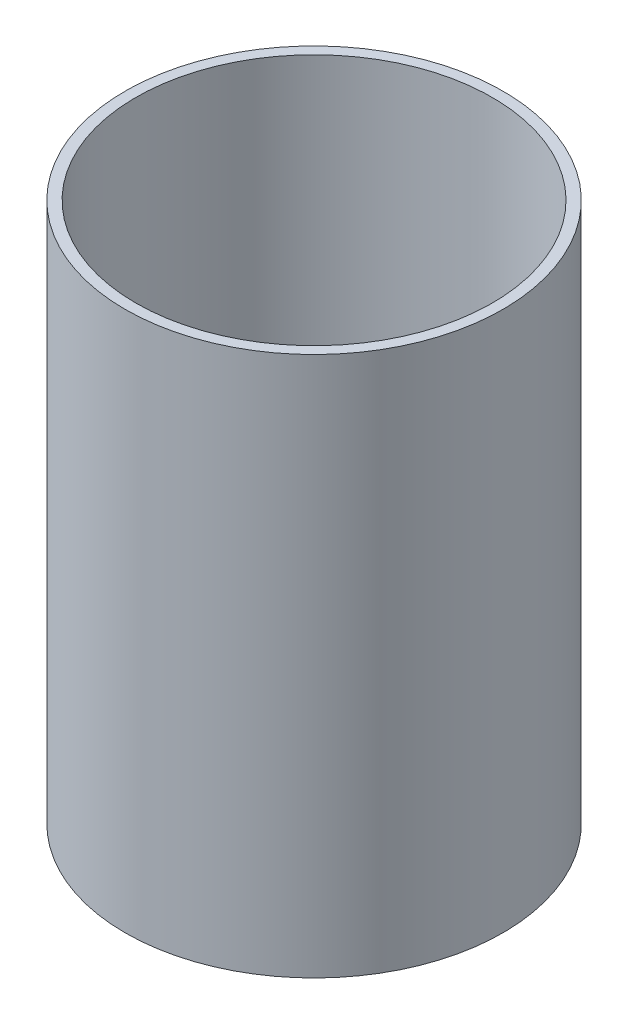
ISO-10303-21;
HEADER;
FILE_DESCRIPTION(('STEP AP214'),'2;1');
FILE_NAME('part.step','',(''),(''),'','','');
FILE_SCHEMA(('AUTOMOTIVE_DESIGN { 1 0 10303 214 1 1 1 1 }'));
ENDSEC;
DATA;
#1=APPLICATION_CONTEXT('core data for automotive mechanical design processes');
#2=APPLICATION_PROTOCOL_DEFINITION('international standard','automotive_design',2000,#1);
#3=PRODUCT_CONTEXT('',#1,'mechanical');
#4=PRODUCT('Part','Part','',(#3));
#5=PRODUCT_RELATED_PRODUCT_CATEGORY('part','',(#4));
#6=PRODUCT_DEFINITION_FORMATION('','',#4);
#7=PRODUCT_DEFINITION_CONTEXT('part definition',#1,'design');
#8=PRODUCT_DEFINITION('design','',#6,#7);
#9=PRODUCT_DEFINITION_SHAPE('','',#8);
#10=(LENGTH_UNIT() NAMED_UNIT(*) SI_UNIT(.MILLI.,.METRE.));
#11=(NAMED_UNIT(*) PLANE_ANGLE_UNIT() SI_UNIT($,.RADIAN.));
#12=(NAMED_UNIT(*) SI_UNIT($,.STERADIAN.) SOLID_ANGLE_UNIT());
#13=UNCERTAINTY_MEASURE_WITH_UNIT(LENGTH_MEASURE(1.E-05),#10,'distance_accuracy_value','');
#14=(GEOMETRIC_REPRESENTATION_CONTEXT(3) GLOBAL_UNCERTAINTY_ASSIGNED_CONTEXT((#13)) GLOBAL_UNIT_ASSIGNED_CONTEXT((#10,
#11,#12)) REPRESENTATION_CONTEXT('',''));
#15=CARTESIAN_POINT('',(0.,0.,0.));
#16=DIRECTION('',(0.,0.,1.));
#17=DIRECTION('',(1.,0.,0.));
#18=AXIS2_PLACEMENT_3D('',#15,#16,#17);
#19=CARTESIAN_POINT('',(0.,50.,0.));
#20=DIRECTION('',(0.,1.,0.));
#21=DIRECTION('',(0.,0.,1.));
#22=AXIS2_PLACEMENT_3D('',#19,#20,#21);
#23=PLANE('',#22);
#24=CARTESIAN_POINT('',(0.,50.,0.));
#25=DIRECTION('',(0.,1.,0.));
#26=DIRECTION('',(0.,0.,1.));
#27=AXIS2_PLACEMENT_3D('',#24,#25,#26);
#28=CIRCLE('',#27,17.5);
#29=CARTESIAN_POINT('',(0.,50.,17.5));
#30=VERTEX_POINT('',#29);
#31=EDGE_CURVE('E50',#30,#30,#28,.T.);
#32=ORIENTED_EDGE('',*,*,#31,.T.);
#33=EDGE_LOOP('',(#32));
#34=FACE_BOUND('',#33,.T.);
#35=CARTESIAN_POINT('',(0.,50.,0.));
#36=DIRECTION('',(0.,1.,0.));
#37=DIRECTION('',(0.,0.,1.));
#38=AXIS2_PLACEMENT_3D('',#35,#36,#37);
#39=CIRCLE('',#38,16.5);
#40=CARTESIAN_POINT('',(0.,50.,16.5));
#41=VERTEX_POINT('',#40);
#42=EDGE_CURVE('E61',#41,#41,#39,.T.);
#43=ORIENTED_EDGE('',*,*,#42,.F.);
#44=EDGE_LOOP('',(#43));
#45=FACE_BOUND('',#44,.T.);
#46=ADVANCED_FACE('F42',(#34,#45),#23,.T.);
#47=CARTESIAN_POINT('',(0.,0.,0.));
#48=DIRECTION('',(0.,1.,0.));
#49=DIRECTION('',(0.,0.,1.));
#50=AXIS2_PLACEMENT_3D('',#47,#48,#49);
#51=PLANE('',#50);
#52=CARTESIAN_POINT('',(0.,0.,0.));
#53=DIRECTION('',(0.,1.,0.));
#54=DIRECTION('',(0.,0.,1.));
#55=AXIS2_PLACEMENT_3D('',#52,#53,#54);
#56=CIRCLE('',#55,17.5);
#57=CARTESIAN_POINT('',(0.,0.,17.5));
#58=VERTEX_POINT('',#57);
#59=EDGE_CURVE('E55',#58,#58,#56,.T.);
#60=ORIENTED_EDGE('',*,*,#59,.F.);
#61=EDGE_LOOP('',(#60));
#62=FACE_BOUND('',#61,.T.);
#63=ADVANCED_FACE('F70',(#62),#51,.F.);
#64=CARTESIAN_POINT('',(0.,50.,0.));
#65=DIRECTION('',(0.,-1.,0.));
#66=DIRECTION('',(0.,0.,-1.));
#67=AXIS2_PLACEMENT_3D('',#64,#65,#66);
#68=CYLINDRICAL_SURFACE('',#67,17.5);
#69=ORIENTED_EDGE('',*,*,#31,.F.);
#70=EDGE_LOOP('',(#69));
#71=FACE_BOUND('',#70,.T.);
#72=ORIENTED_EDGE('',*,*,#59,.T.);
#73=EDGE_LOOP('',(#72));
#74=FACE_BOUND('',#73,.T.);
#75=ADVANCED_FACE('F44',(#71,#74),#68,.T.);
#76=CARTESIAN_POINT('',(0.,50.,0.));
#77=DIRECTION('',(0.,-1.,0.));
#78=DIRECTION('',(0.,0.,-1.));
#79=AXIS2_PLACEMENT_3D('',#76,#77,#78);
#80=CYLINDRICAL_SURFACE('',#79,16.5);
#81=CARTESIAN_POINT('',(0.,2.,0.));
#82=DIRECTION('',(0.,1.,0.));
#83=DIRECTION('',(0.,0.,1.));
#84=AXIS2_PLACEMENT_3D('',#81,#82,#83);
#85=CIRCLE('',#84,16.5);
#86=CARTESIAN_POINT('',(0.,2.,16.5));
#87=VERTEX_POINT('',#86);
#88=EDGE_CURVE('E10',#87,#87,#85,.T.);
#89=ORIENTED_EDGE('',*,*,#88,.F.);
#90=EDGE_LOOP('',(#89));
#91=FACE_BOUND('',#90,.T.);
#92=ORIENTED_EDGE('',*,*,#42,.T.);
#93=EDGE_LOOP('',(#92));
#94=FACE_BOUND('',#93,.T.);
#95=ADVANCED_FACE('F67',(#91,#94),#80,.F.);
#96=CARTESIAN_POINT('',(0.,2.,0.));
#97=DIRECTION('',(0.,1.,0.));
#98=DIRECTION('',(0.,0.,1.));
#99=AXIS2_PLACEMENT_3D('',#96,#97,#98);
#100=PLANE('',#99);
#101=ORIENTED_EDGE('',*,*,#88,.T.);
#102=EDGE_LOOP('',(#101));
#103=FACE_BOUND('',#102,.T.);
#104=ADVANCED_FACE('F79',(#103),#100,.T.);
#105=CLOSED_SHELL('',(#46,#63,#75,#95,#104));
#106=MANIFOLD_SOLID_BREP('B2',#105);
#107=ADVANCED_BREP_SHAPE_REPRESENTATION('',(#18,#106),#14);
#108=SHAPE_DEFINITION_REPRESENTATION(#9,#107);
ENDSEC;
END-ISO-10303-21;
